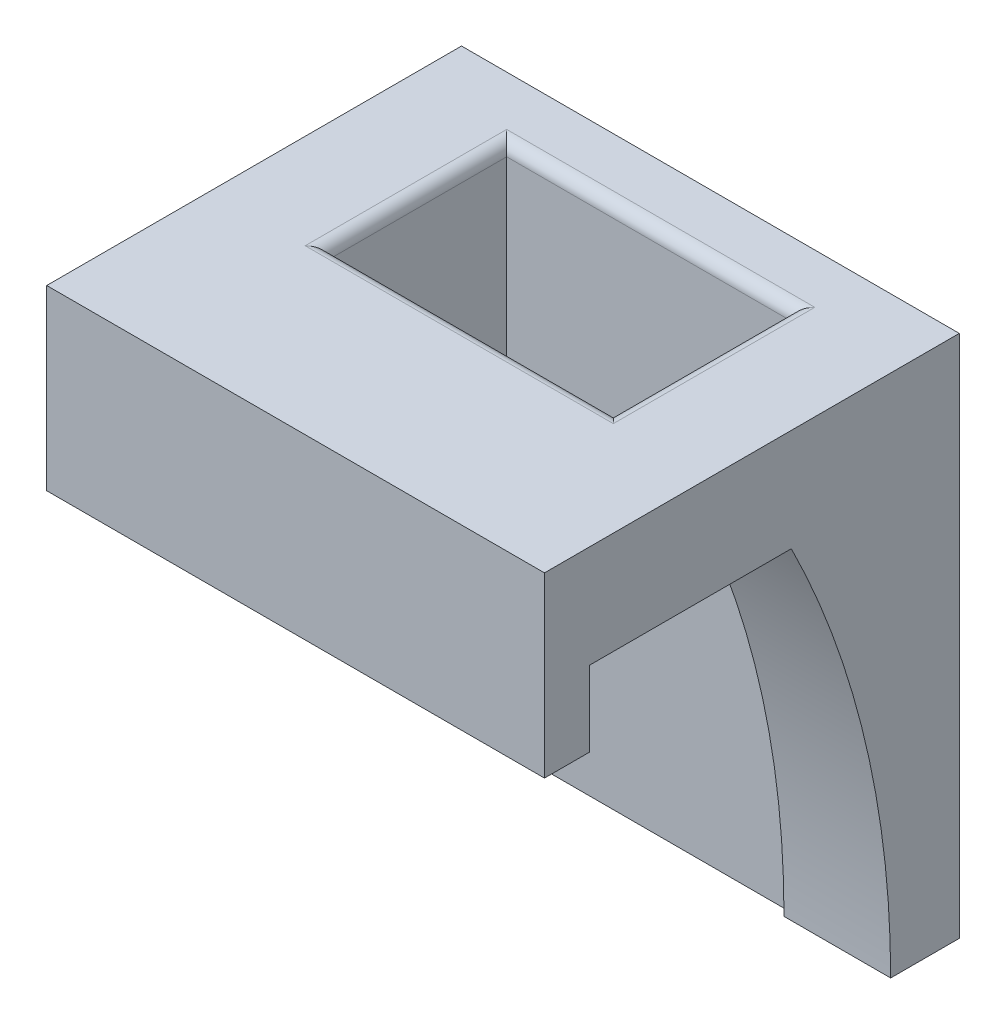
ISO-10303-21;
HEADER;
FILE_DESCRIPTION(('STEP AP214'),'2;1');
FILE_NAME('part.step','',(''),(''),'','','');
FILE_SCHEMA(('AUTOMOTIVE_DESIGN { 1 0 10303 214 1 1 1 1 }'));
ENDSEC;
DATA;
#1=APPLICATION_CONTEXT('core data for automotive mechanical design processes');
#2=APPLICATION_PROTOCOL_DEFINITION('international standard','automotive_design',2000,#1);
#3=PRODUCT_CONTEXT('',#1,'mechanical');
#4=PRODUCT('Part','Part','',(#3));
#5=PRODUCT_RELATED_PRODUCT_CATEGORY('part','',(#4));
#6=PRODUCT_DEFINITION_FORMATION('','',#4);
#7=PRODUCT_DEFINITION_CONTEXT('part definition',#1,'design');
#8=PRODUCT_DEFINITION('design','',#6,#7);
#9=PRODUCT_DEFINITION_SHAPE('','',#8);
#10=(LENGTH_UNIT() NAMED_UNIT(*) SI_UNIT(.MILLI.,.METRE.));
#11=(NAMED_UNIT(*) PLANE_ANGLE_UNIT() SI_UNIT($,.RADIAN.));
#12=(NAMED_UNIT(*) SI_UNIT($,.STERADIAN.) SOLID_ANGLE_UNIT());
#13=UNCERTAINTY_MEASURE_WITH_UNIT(LENGTH_MEASURE(1.E-05),#10,'distance_accuracy_value','');
#14=(GEOMETRIC_REPRESENTATION_CONTEXT(3) GLOBAL_UNCERTAINTY_ASSIGNED_CONTEXT((#13)) GLOBAL_UNIT_ASSIGNED_CONTEXT((#10,
#11,#12)) REPRESENTATION_CONTEXT('',''));
#15=CARTESIAN_POINT('',(0.,0.,0.));
#16=DIRECTION('',(0.,0.,1.));
#17=DIRECTION('',(1.,0.,0.));
#18=AXIS2_PLACEMENT_3D('',#15,#16,#17);
#19=CARTESIAN_POINT('',(21.,-35.56,54.2213030303032));
#20=DIRECTION('',(-1.,0.,0.));
#21=DIRECTION('',(0.,0.,1.));
#22=AXIS2_PLACEMENT_3D('',#19,#20,#21);
#23=CYLINDRICAL_SURFACE('',#22,79.6213030303032);
#24=DIRECTION('',(-1.,0.,0.));
#25=VECTOR('',#24,1.);
#26=CARTESIAN_POINT('',(21.,-35.56,-25.4));
#27=LINE('',#26,#25);
#28=CARTESIAN_POINT('',(-12.,-35.56,-25.4));
#29=VERTEX_POINT('',#28);
#30=CARTESIAN_POINT('',(-21.,-35.56,-25.4));
#31=VERTEX_POINT('',#30);
#32=EDGE_CURVE('E288',#29,#31,#27,.T.);
#33=ORIENTED_EDGE('',*,*,#32,.F.);
#34=CARTESIAN_POINT('',(-12.,-35.56,54.2213030303032));
#35=DIRECTION('',(-1.,0.,0.));
#36=DIRECTION('',(0.,0.,1.));
#37=AXIS2_PLACEMENT_3D('',#34,#35,#36);
#38=CIRCLE('',#37,79.6213030303032);
#39=CARTESIAN_POINT('',(-12.,0.,-17.018));
#40=VERTEX_POINT('',#39);
#41=EDGE_CURVE('E204',#29,#40,#38,.F.);
#42=ORIENTED_EDGE('',*,*,#41,.T.);
#43=DIRECTION('',(-1.,0.,0.));
#44=VECTOR('',#43,1.);
#45=CARTESIAN_POINT('',(21.,0.,-17.018));
#46=LINE('',#45,#44);
#47=CARTESIAN_POINT('',(-21.,0.,-17.018));
#48=VERTEX_POINT('',#47);
#49=EDGE_CURVE('E290',#40,#48,#46,.T.);
#50=ORIENTED_EDGE('',*,*,#49,.T.);
#51=CARTESIAN_POINT('',(-21.,-35.56,54.2213030303032));
#52=DIRECTION('',(-1.,0.,0.));
#53=DIRECTION('',(0.,0.,-1.));
#54=AXIS2_PLACEMENT_3D('',#51,#52,#53);
#55=CIRCLE('',#54,79.6213030303032);
#56=EDGE_CURVE('E241',#48,#31,#55,.T.);
#57=ORIENTED_EDGE('',*,*,#56,.T.);
#58=EDGE_LOOP('',(#33,#42,#50,#57));
#59=FACE_BOUND('',#58,.T.);
#60=ADVANCED_FACE('F43',(#59),#23,.F.);
#61=CARTESIAN_POINT('',(21.,0.,0.));
#62=DIRECTION('',(0.,1.,0.));
#63=DIRECTION('',(0.,0.,1.));
#64=AXIS2_PLACEMENT_3D('',#61,#62,#63);
#65=PLANE('',#64);
#66=ORIENTED_EDGE('',*,*,#49,.F.);
#67=DIRECTION('',(0.,0.,1.));
#68=VECTOR('',#67,1.);
#69=CARTESIAN_POINT('',(-12.,0.,0.));
#70=LINE('',#69,#68);
#71=CARTESIAN_POINT('',(-12.,0.,-11.));
#72=VERTEX_POINT('',#71);
#73=EDGE_CURVE('E208',#40,#72,#70,.T.);
#74=ORIENTED_EDGE('',*,*,#73,.T.);
#75=DIRECTION('',(1.,0.,0.));
#76=VECTOR('',#75,1.);
#77=CARTESIAN_POINT('',(21.,0.,-11.));
#78=LINE('',#77,#76);
#79=CARTESIAN_POINT('',(12.,0.,-11.));
#80=VERTEX_POINT('',#79);
#81=EDGE_CURVE('E186',#72,#80,#78,.T.);
#82=ORIENTED_EDGE('',*,*,#81,.T.);
#83=DIRECTION('',(0.,0.,-1.));
#84=VECTOR('',#83,1.);
#85=CARTESIAN_POINT('',(12.,0.,0.));
#86=LINE('',#85,#84);
#87=CARTESIAN_POINT('',(12.,0.,-17.018));
#88=VERTEX_POINT('',#87);
#89=EDGE_CURVE('E199',#80,#88,#86,.T.);
#90=ORIENTED_EDGE('',*,*,#89,.T.);
#91=CARTESIAN_POINT('',(21.,0.,-17.018));
#92=VERTEX_POINT('',#91);
#93=EDGE_CURVE('E286',#92,#88,#46,.T.);
#94=ORIENTED_EDGE('',*,*,#93,.F.);
#95=DIRECTION('',(0.,0.,-1.));
#96=VECTOR('',#95,1.);
#97=CARTESIAN_POINT('',(21.,0.,0.));
#98=LINE('',#97,#96);
#99=CARTESIAN_POINT('',(21.,0.,0.));
#100=VERTEX_POINT('',#99);
#101=EDGE_CURVE('E213',#100,#92,#98,.T.);
#102=ORIENTED_EDGE('',*,*,#101,.F.);
#103=DIRECTION('',(-1.,0.,0.));
#104=VECTOR('',#103,1.);
#105=CARTESIAN_POINT('',(21.,0.,0.));
#106=LINE('',#105,#104);
#107=CARTESIAN_POINT('',(-21.,0.,0.));
#108=VERTEX_POINT('',#107);
#109=EDGE_CURVE('E239',#100,#108,#106,.T.);
#110=ORIENTED_EDGE('',*,*,#109,.T.);
#111=DIRECTION('',(0.,0.,-1.));
#112=VECTOR('',#111,1.);
#113=CARTESIAN_POINT('',(-21.,0.,0.));
#114=LINE('',#113,#112);
#115=EDGE_CURVE('E215',#108,#48,#114,.T.);
#116=ORIENTED_EDGE('',*,*,#115,.T.);
#117=EDGE_LOOP('',(#66,#74,#82,#90,#94,#102,#110,#116));
#118=FACE_BOUND('',#117,.T.);
#119=ADVANCED_FACE('F351',(#118),#65,.F.);
#120=ORIENTED_EDGE('',*,*,#93,.T.);
#121=CARTESIAN_POINT('',(12.,-35.56,54.2213030303032));
#122=DIRECTION('',(1.,0.,0.));
#123=DIRECTION('',(0.,0.,-1.));
#124=AXIS2_PLACEMENT_3D('',#121,#122,#123);
#125=CIRCLE('',#124,79.6213030303032);
#126=CARTESIAN_POINT('',(12.,-35.56,-25.4));
#127=VERTEX_POINT('',#126);
#128=EDGE_CURVE('E197',#88,#127,#125,.F.);
#129=ORIENTED_EDGE('',*,*,#128,.T.);
#130=CARTESIAN_POINT('',(21.,-35.56,-25.4));
#131=VERTEX_POINT('',#130);
#132=EDGE_CURVE('E177',#131,#127,#27,.T.);
#133=ORIENTED_EDGE('',*,*,#132,.F.);
#134=CARTESIAN_POINT('',(21.,-35.56,54.2213030303032));
#135=DIRECTION('',(-1.,0.,0.));
#136=DIRECTION('',(0.,0.,-1.));
#137=AXIS2_PLACEMENT_3D('',#134,#135,#136);
#138=CIRCLE('',#137,79.6213030303032);
#139=EDGE_CURVE('E220',#92,#131,#138,.T.);
#140=ORIENTED_EDGE('',*,*,#139,.F.);
#141=EDGE_LOOP('',(#120,#129,#133,#140));
#142=FACE_BOUND('',#141,.T.);
#143=ADVANCED_FACE('F358',(#142),#23,.F.);
#144=CARTESIAN_POINT('',(21.,-35.56,-31.19));
#145=DIRECTION('',(0.,1.,0.));
#146=DIRECTION('',(0.,0.,1.));
#147=AXIS2_PLACEMENT_3D('',#144,#145,#146);
#148=PLANE('',#147);
#149=DIRECTION('',(-1.,0.,0.));
#150=VECTOR('',#149,1.);
#151=CARTESIAN_POINT('',(-12.,-35.56,-26.));
#152=LINE('',#151,#150);
#153=CARTESIAN_POINT('',(12.,-35.56,-26.));
#154=VERTEX_POINT('',#153);
#155=CARTESIAN_POINT('',(-12.,-35.56,-26.));
#156=VERTEX_POINT('',#155);
#157=EDGE_CURVE('E170',#154,#156,#152,.T.);
#158=ORIENTED_EDGE('',*,*,#157,.T.);
#159=DIRECTION('',(0.,0.,1.));
#160=VECTOR('',#159,1.);
#161=CARTESIAN_POINT('',(-12.,-35.56,-26.));
#162=LINE('',#161,#160);
#163=EDGE_CURVE('E176',#156,#29,#162,.T.);
#164=ORIENTED_EDGE('',*,*,#163,.T.);
#165=ORIENTED_EDGE('',*,*,#32,.T.);
#166=DIRECTION('',(0.,0.,-1.));
#167=VECTOR('',#166,1.);
#168=CARTESIAN_POINT('',(-21.,-35.56,-31.19));
#169=LINE('',#168,#167);
#170=CARTESIAN_POINT('',(-21.,-35.56,-31.19));
#171=VERTEX_POINT('',#170);
#172=EDGE_CURVE('E249',#31,#171,#169,.T.);
#173=ORIENTED_EDGE('',*,*,#172,.T.);
#174=DIRECTION('',(-1.,0.,0.));
#175=VECTOR('',#174,1.);
#176=CARTESIAN_POINT('',(21.,-35.56,-31.19));
#177=LINE('',#176,#175);
#178=CARTESIAN_POINT('',(21.,-35.56,-31.19));
#179=VERTEX_POINT('',#178);
#180=EDGE_CURVE('E285',#179,#171,#177,.T.);
#181=ORIENTED_EDGE('',*,*,#180,.F.);
#182=DIRECTION('',(0.,0.,-1.));
#183=VECTOR('',#182,1.);
#184=CARTESIAN_POINT('',(21.,-35.56,-31.19));
#185=LINE('',#184,#183);
#186=EDGE_CURVE('E222',#131,#179,#185,.T.);
#187=ORIENTED_EDGE('',*,*,#186,.F.);
#188=ORIENTED_EDGE('',*,*,#132,.T.);
#189=DIRECTION('',(0.,0.,-1.));
#190=VECTOR('',#189,1.);
#191=CARTESIAN_POINT('',(12.,-35.56,-26.));
#192=LINE('',#191,#190);
#193=EDGE_CURVE('E159',#127,#154,#192,.T.);
#194=ORIENTED_EDGE('',*,*,#193,.T.);
#195=EDGE_LOOP('',(#158,#164,#165,#173,#181,#187,#188,#194));
#196=FACE_BOUND('',#195,.T.);
#197=ADVANCED_FACE('F172',(#196),#148,.F.);
#198=CARTESIAN_POINT('',(21.,8.65,-31.19));
#199=DIRECTION('',(0.,0.,1.));
#200=DIRECTION('',(1.,0.,0.));
#201=AXIS2_PLACEMENT_3D('',#198,#199,#200);
#202=PLANE('',#201);
#203=DIRECTION('',(0.,1.,0.));
#204=VECTOR('',#203,1.);
#205=CARTESIAN_POINT('',(-21.,8.65,-31.19));
#206=LINE('',#205,#204);
#207=CARTESIAN_POINT('',(-21.,8.65,-31.19));
#208=VERTEX_POINT('',#207);
#209=EDGE_CURVE('E246',#171,#208,#206,.T.);
#210=ORIENTED_EDGE('',*,*,#209,.T.);
#211=DIRECTION('',(-1.,0.,0.));
#212=VECTOR('',#211,1.);
#213=CARTESIAN_POINT('',(21.,8.65,-31.19));
#214=LINE('',#213,#212);
#215=CARTESIAN_POINT('',(21.,8.65,-31.19));
#216=VERTEX_POINT('',#215);
#217=EDGE_CURVE('E279',#216,#208,#214,.T.);
#218=ORIENTED_EDGE('',*,*,#217,.F.);
#219=DIRECTION('',(0.,1.,0.));
#220=VECTOR('',#219,1.);
#221=CARTESIAN_POINT('',(21.,8.65,-31.19));
#222=LINE('',#221,#220);
#223=EDGE_CURVE('E221',#179,#216,#222,.T.);
#224=ORIENTED_EDGE('',*,*,#223,.F.);
#225=ORIENTED_EDGE('',*,*,#180,.T.);
#226=EDGE_LOOP('',(#210,#218,#224,#225));
#227=FACE_BOUND('',#226,.T.);
#228=ADVANCED_FACE('F378',(#227),#202,.F.);
#229=CARTESIAN_POINT('',(21.,8.65,3.81));
#230=DIRECTION('',(0.,-1.,0.));
#231=DIRECTION('',(0.,0.,-1.));
#232=AXIS2_PLACEMENT_3D('',#229,#230,#231);
#233=PLANE('',#232);
#234=DIRECTION('',(0.,0.,-1.));
#235=VECTOR('',#234,1.);
#236=CARTESIAN_POINT('',(13.,8.65,3.81));
#237=LINE('',#236,#235);
#238=CARTESIAN_POINT('',(13.,8.65,-27.));
#239=VERTEX_POINT('',#238);
#240=CARTESIAN_POINT('',(13.,8.65,-10.));
#241=VERTEX_POINT('',#240);
#242=EDGE_CURVE('E305',#239,#241,#237,.F.);
#243=ORIENTED_EDGE('',*,*,#242,.T.);
#244=DIRECTION('',(1.,0.,0.));
#245=VECTOR('',#244,1.);
#246=CARTESIAN_POINT('',(21.,8.65,-10.));
#247=LINE('',#246,#245);
#248=CARTESIAN_POINT('',(-13.,8.65,-10.));
#249=VERTEX_POINT('',#248);
#250=EDGE_CURVE('E307',#241,#249,#247,.F.);
#251=ORIENTED_EDGE('',*,*,#250,.T.);
#252=DIRECTION('',(0.,0.,1.));
#253=VECTOR('',#252,1.);
#254=CARTESIAN_POINT('',(-13.,8.65,3.81));
#255=LINE('',#254,#253);
#256=CARTESIAN_POINT('',(-13.,8.65,-27.));
#257=VERTEX_POINT('',#256);
#258=EDGE_CURVE('E296',#249,#257,#255,.F.);
#259=ORIENTED_EDGE('',*,*,#258,.T.);
#260=DIRECTION('',(-1.,0.,0.));
#261=VECTOR('',#260,1.);
#262=CARTESIAN_POINT('',(21.,8.65,-27.));
#263=LINE('',#262,#261);
#264=EDGE_CURVE('E303',#257,#239,#263,.F.);
#265=ORIENTED_EDGE('',*,*,#264,.T.);
#266=EDGE_LOOP('',(#243,#251,#259,#265));
#267=FACE_BOUND('',#266,.T.);
#268=DIRECTION('',(0.,0.,1.));
#269=VECTOR('',#268,1.);
#270=CARTESIAN_POINT('',(-21.,8.65,3.81));
#271=LINE('',#270,#269);
#272=CARTESIAN_POINT('',(-21.,8.65,3.81));
#273=VERTEX_POINT('',#272);
#274=EDGE_CURVE('E251',#208,#273,#271,.T.);
#275=ORIENTED_EDGE('',*,*,#274,.T.);
#276=DIRECTION('',(-1.,0.,0.));
#277=VECTOR('',#276,1.);
#278=CARTESIAN_POINT('',(21.,8.65,3.81));
#279=LINE('',#278,#277);
#280=CARTESIAN_POINT('',(21.,8.65,3.81));
#281=VERTEX_POINT('',#280);
#282=EDGE_CURVE('E273',#281,#273,#279,.T.);
#283=ORIENTED_EDGE('',*,*,#282,.F.);
#284=DIRECTION('',(0.,0.,1.));
#285=VECTOR('',#284,1.);
#286=CARTESIAN_POINT('',(21.,8.65,3.81));
#287=LINE('',#286,#285);
#288=EDGE_CURVE('E230',#216,#281,#287,.T.);
#289=ORIENTED_EDGE('',*,*,#288,.F.);
#290=ORIENTED_EDGE('',*,*,#217,.T.);
#291=EDGE_LOOP('',(#275,#283,#289,#290));
#292=FACE_BOUND('',#291,.T.);
#293=ADVANCED_FACE('F336',(#267,#292),#233,.F.);
#294=CARTESIAN_POINT('',(21.,-6.35,3.81));
#295=DIRECTION('',(0.,0.,-1.));
#296=DIRECTION('',(-1.,0.,0.));
#297=AXIS2_PLACEMENT_3D('',#294,#295,#296);
#298=PLANE('',#297);
#299=DIRECTION('',(0.,-1.,0.));
#300=VECTOR('',#299,1.);
#301=CARTESIAN_POINT('',(-21.,-6.35,3.81));
#302=LINE('',#301,#300);
#303=CARTESIAN_POINT('',(-21.,-6.35,3.81));
#304=VERTEX_POINT('',#303);
#305=EDGE_CURVE('E258',#273,#304,#302,.T.);
#306=ORIENTED_EDGE('',*,*,#305,.T.);
#307=DIRECTION('',(-1.,0.,0.));
#308=VECTOR('',#307,1.);
#309=CARTESIAN_POINT('',(21.,-6.35,3.81));
#310=LINE('',#309,#308);
#311=CARTESIAN_POINT('',(21.,-6.35,3.81));
#312=VERTEX_POINT('',#311);
#313=EDGE_CURVE('E269',#312,#304,#310,.T.);
#314=ORIENTED_EDGE('',*,*,#313,.F.);
#315=DIRECTION('',(0.,-1.,0.));
#316=VECTOR('',#315,1.);
#317=CARTESIAN_POINT('',(21.,-6.35,3.81));
#318=LINE('',#317,#316);
#319=EDGE_CURVE('E227',#281,#312,#318,.T.);
#320=ORIENTED_EDGE('',*,*,#319,.F.);
#321=ORIENTED_EDGE('',*,*,#282,.T.);
#322=EDGE_LOOP('',(#306,#314,#320,#321));
#323=FACE_BOUND('',#322,.T.);
#324=ADVANCED_FACE('F387',(#323),#298,.F.);
#325=CARTESIAN_POINT('',(21.,-6.35,0.));
#326=DIRECTION('',(0.,1.,0.));
#327=DIRECTION('',(0.,0.,1.));
#328=AXIS2_PLACEMENT_3D('',#325,#326,#327);
#329=PLANE('',#328);
#330=DIRECTION('',(0.,0.,-1.));
#331=VECTOR('',#330,1.);
#332=CARTESIAN_POINT('',(-21.,-6.35,0.));
#333=LINE('',#332,#331);
#334=CARTESIAN_POINT('',(-21.,-6.35,0.));
#335=VERTEX_POINT('',#334);
#336=EDGE_CURVE('E259',#304,#335,#333,.T.);
#337=ORIENTED_EDGE('',*,*,#336,.T.);
#338=DIRECTION('',(-1.,0.,0.));
#339=VECTOR('',#338,1.);
#340=CARTESIAN_POINT('',(21.,-6.35,0.));
#341=LINE('',#340,#339);
#342=CARTESIAN_POINT('',(21.,-6.35,0.));
#343=VERTEX_POINT('',#342);
#344=EDGE_CURVE('E266',#343,#335,#341,.T.);
#345=ORIENTED_EDGE('',*,*,#344,.F.);
#346=DIRECTION('',(0.,0.,-1.));
#347=VECTOR('',#346,1.);
#348=CARTESIAN_POINT('',(21.,-6.35,0.));
#349=LINE('',#348,#347);
#350=EDGE_CURVE('E232',#312,#343,#349,.T.);
#351=ORIENTED_EDGE('',*,*,#350,.F.);
#352=ORIENTED_EDGE('',*,*,#313,.T.);
#353=EDGE_LOOP('',(#337,#345,#351,#352));
#354=FACE_BOUND('',#353,.T.);
#355=ADVANCED_FACE('F393',(#354),#329,.F.);
#356=CARTESIAN_POINT('',(21.,0.,0.));
#357=DIRECTION('',(0.,0.,1.));
#358=DIRECTION('',(0.,-1.,0.));
#359=AXIS2_PLACEMENT_3D('',#356,#357,#358);
#360=PLANE('',#359);
#361=DIRECTION('',(0.,1.,0.));
#362=VECTOR('',#361,1.);
#363=CARTESIAN_POINT('',(-21.,0.,0.));
#364=LINE('',#363,#362);
#365=EDGE_CURVE('E217',#335,#108,#364,.T.);
#366=ORIENTED_EDGE('',*,*,#365,.T.);
#367=ORIENTED_EDGE('',*,*,#109,.F.);
#368=DIRECTION('',(0.,1.,0.));
#369=VECTOR('',#368,1.);
#370=CARTESIAN_POINT('',(21.,0.,0.));
#371=LINE('',#370,#369);
#372=EDGE_CURVE('E237',#343,#100,#371,.T.);
#373=ORIENTED_EDGE('',*,*,#372,.F.);
#374=ORIENTED_EDGE('',*,*,#344,.T.);
#375=EDGE_LOOP('',(#366,#367,#373,#374));
#376=FACE_BOUND('',#375,.T.);
#377=ADVANCED_FACE('F395',(#376),#360,.F.);
#378=CARTESIAN_POINT('',(21.,-35.56,54.2213030303032));
#379=DIRECTION('',(1.,0.,0.));
#380=DIRECTION('',(0.,0.,-1.));
#381=AXIS2_PLACEMENT_3D('',#378,#379,#380);
#382=PLANE('',#381);
#383=ORIENTED_EDGE('',*,*,#101,.T.);
#384=ORIENTED_EDGE('',*,*,#139,.T.);
#385=ORIENTED_EDGE('',*,*,#186,.T.);
#386=ORIENTED_EDGE('',*,*,#223,.T.);
#387=ORIENTED_EDGE('',*,*,#288,.T.);
#388=ORIENTED_EDGE('',*,*,#319,.T.);
#389=ORIENTED_EDGE('',*,*,#350,.T.);
#390=ORIENTED_EDGE('',*,*,#372,.T.);
#391=EDGE_LOOP('',(#383,#384,#385,#386,#387,#388,#389,#390));
#392=FACE_BOUND('',#391,.T.);
#393=ADVANCED_FACE('F357',(#392),#382,.T.);
#394=CARTESIAN_POINT('',(-21.,-35.56,54.2213030303032));
#395=DIRECTION('',(1.,0.,0.));
#396=DIRECTION('',(0.,0.,-1.));
#397=AXIS2_PLACEMENT_3D('',#394,#395,#396);
#398=PLANE('',#397);
#399=ORIENTED_EDGE('',*,*,#115,.F.);
#400=ORIENTED_EDGE('',*,*,#365,.F.);
#401=ORIENTED_EDGE('',*,*,#336,.F.);
#402=ORIENTED_EDGE('',*,*,#305,.F.);
#403=ORIENTED_EDGE('',*,*,#274,.F.);
#404=ORIENTED_EDGE('',*,*,#209,.F.);
#405=ORIENTED_EDGE('',*,*,#172,.F.);
#406=ORIENTED_EDGE('',*,*,#56,.F.);
#407=EDGE_LOOP('',(#399,#400,#401,#402,#403,#404,#405,#406));
#408=FACE_BOUND('',#407,.T.);
#409=ADVANCED_FACE('F368',(#408),#398,.F.);
#410=CARTESIAN_POINT('',(-12.,-35.56,-26.));
#411=DIRECTION('',(-1.,0.,0.));
#412=DIRECTION('',(0.,0.,1.));
#413=AXIS2_PLACEMENT_3D('',#410,#411,#412);
#414=PLANE('',#413);
#415=DIRECTION('',(0.,1.,0.));
#416=VECTOR('',#415,1.);
#417=CARTESIAN_POINT('',(-12.,-35.56,-26.));
#418=LINE('',#417,#416);
#419=CARTESIAN_POINT('',(-12.,7.65,-26.));
#420=VERTEX_POINT('',#419);
#421=EDGE_CURVE('E162',#156,#420,#418,.T.);
#422=ORIENTED_EDGE('',*,*,#421,.T.);
#423=DIRECTION('',(0.,0.,1.));
#424=VECTOR('',#423,1.);
#425=CARTESIAN_POINT('',(-12.,7.65,-26.));
#426=LINE('',#425,#424);
#427=CARTESIAN_POINT('',(-12.,7.65,-11.));
#428=VERTEX_POINT('',#427);
#429=EDGE_CURVE('E11',#420,#428,#426,.T.);
#430=ORIENTED_EDGE('',*,*,#429,.T.);
#431=DIRECTION('',(0.,1.,0.));
#432=VECTOR('',#431,1.);
#433=CARTESIAN_POINT('',(-12.,-35.56,-11.));
#434=LINE('',#433,#432);
#435=EDGE_CURVE('E175',#72,#428,#434,.T.);
#436=ORIENTED_EDGE('',*,*,#435,.F.);
#437=ORIENTED_EDGE('',*,*,#73,.F.);
#438=ORIENTED_EDGE('',*,*,#41,.F.);
#439=ORIENTED_EDGE('',*,*,#163,.F.);
#440=EDGE_LOOP('',(#422,#430,#436,#437,#438,#439));
#441=FACE_BOUND('',#440,.T.);
#442=ADVANCED_FACE('F372',(#441),#414,.F.);
#443=CARTESIAN_POINT('',(12.,-35.56,-26.));
#444=DIRECTION('',(1.,0.,0.));
#445=DIRECTION('',(0.,0.,-1.));
#446=AXIS2_PLACEMENT_3D('',#443,#444,#445);
#447=PLANE('',#446);
#448=DIRECTION('',(0.,1.,0.));
#449=VECTOR('',#448,1.);
#450=CARTESIAN_POINT('',(12.,-35.56,-11.));
#451=LINE('',#450,#449);
#452=CARTESIAN_POINT('',(12.,7.65,-11.));
#453=VERTEX_POINT('',#452);
#454=EDGE_CURVE('E163',#80,#453,#451,.T.);
#455=ORIENTED_EDGE('',*,*,#454,.T.);
#456=DIRECTION('',(0.,0.,-1.));
#457=VECTOR('',#456,1.);
#458=CARTESIAN_POINT('',(12.,7.65,-26.));
#459=LINE('',#458,#457);
#460=CARTESIAN_POINT('',(12.,7.65,-26.));
#461=VERTEX_POINT('',#460);
#462=EDGE_CURVE('E67',#453,#461,#459,.T.);
#463=ORIENTED_EDGE('',*,*,#462,.T.);
#464=DIRECTION('',(0.,1.,0.));
#465=VECTOR('',#464,1.);
#466=CARTESIAN_POINT('',(12.,-35.56,-26.));
#467=LINE('',#466,#465);
#468=EDGE_CURVE('E156',#154,#461,#467,.T.);
#469=ORIENTED_EDGE('',*,*,#468,.F.);
#470=ORIENTED_EDGE('',*,*,#193,.F.);
#471=ORIENTED_EDGE('',*,*,#128,.F.);
#472=ORIENTED_EDGE('',*,*,#89,.F.);
#473=EDGE_LOOP('',(#455,#463,#469,#470,#471,#472));
#474=FACE_BOUND('',#473,.T.);
#475=ADVANCED_FACE('F158',(#474),#447,.F.);
#476=CARTESIAN_POINT('',(-12.,-35.56,-11.));
#477=DIRECTION('',(0.,0.,1.));
#478=DIRECTION('',(1.,0.,0.));
#479=AXIS2_PLACEMENT_3D('',#476,#477,#478);
#480=PLANE('',#479);
#481=ORIENTED_EDGE('',*,*,#435,.T.);
#482=DIRECTION('',(1.,0.,0.));
#483=VECTOR('',#482,1.);
#484=CARTESIAN_POINT('',(-12.,7.65,-11.));
#485=LINE('',#484,#483);
#486=EDGE_CURVE('E294',#428,#453,#485,.T.);
#487=ORIENTED_EDGE('',*,*,#486,.T.);
#488=ORIENTED_EDGE('',*,*,#454,.F.);
#489=ORIENTED_EDGE('',*,*,#81,.F.);
#490=EDGE_LOOP('',(#481,#487,#488,#489));
#491=FACE_BOUND('',#490,.T.);
#492=ADVANCED_FACE('F346',(#491),#480,.F.);
#493=CARTESIAN_POINT('',(-12.,-35.56,-26.));
#494=DIRECTION('',(0.,0.,-1.));
#495=DIRECTION('',(-1.,0.,0.));
#496=AXIS2_PLACEMENT_3D('',#493,#494,#495);
#497=PLANE('',#496);
#498=ORIENTED_EDGE('',*,*,#468,.T.);
#499=DIRECTION('',(-1.,0.,0.));
#500=VECTOR('',#499,1.);
#501=CARTESIAN_POINT('',(-12.,7.65,-26.));
#502=LINE('',#501,#500);
#503=EDGE_CURVE('E52',#461,#420,#502,.T.);
#504=ORIENTED_EDGE('',*,*,#503,.T.);
#505=ORIENTED_EDGE('',*,*,#421,.F.);
#506=ORIENTED_EDGE('',*,*,#157,.F.);
#507=EDGE_LOOP('',(#498,#504,#505,#506));
#508=FACE_BOUND('',#507,.T.);
#509=ADVANCED_FACE('F169',(#508),#497,.F.);
#510=CARTESIAN_POINT('',(-12.,7.65,-27.));
#511=DIRECTION('',(-1.,0.,0.));
#512=DIRECTION('',(0.,0.,1.));
#513=AXIS2_PLACEMENT_3D('',#510,#511,#512);
#514=CYLINDRICAL_SURFACE('',#513,1.);
#515=CARTESIAN_POINT('',(13.,7.65,-27.));
#516=DIRECTION('',(-0.707106781186548,0.,-0.707106781186547));
#517=DIRECTION('',(0.707106781186547,0.,-0.707106781186548));
#518=AXIS2_PLACEMENT_3D('',#515,#516,#517);
#519=ELLIPSE('',#518,1.41421356237309,1.);
#520=EDGE_CURVE('E319',#239,#461,#519,.F.);
#521=ORIENTED_EDGE('',*,*,#520,.F.);
#522=ORIENTED_EDGE('',*,*,#264,.F.);
#523=CARTESIAN_POINT('',(-13.,7.65,-27.));
#524=DIRECTION('',(-0.707106781186547,0.,0.707106781186548));
#525=DIRECTION('',(-0.707106781186548,0.,-0.707106781186547));
#526=AXIS2_PLACEMENT_3D('',#523,#524,#525);
#527=ELLIPSE('',#526,1.4142135623731,1.);
#528=EDGE_CURVE('E50',#420,#257,#527,.T.);
#529=ORIENTED_EDGE('',*,*,#528,.F.);
#530=ORIENTED_EDGE('',*,*,#503,.F.);
#531=EDGE_LOOP('',(#521,#522,#529,#530));
#532=FACE_BOUND('',#531,.T.);
#533=ADVANCED_FACE('F44',(#532),#514,.T.);
#534=CARTESIAN_POINT('',(-13.,7.65,-26.));
#535=DIRECTION('',(0.,0.,1.));
#536=DIRECTION('',(1.,0.,0.));
#537=AXIS2_PLACEMENT_3D('',#534,#535,#536);
#538=CYLINDRICAL_SURFACE('',#537,1.);
#539=ORIENTED_EDGE('',*,*,#528,.T.);
#540=ORIENTED_EDGE('',*,*,#258,.F.);
#541=CARTESIAN_POINT('',(-13.,7.65,-10.));
#542=DIRECTION('',(0.707106781186548,0.,0.707106781186547));
#543=DIRECTION('',(0.707106781186547,0.,-0.707106781186548));
#544=AXIS2_PLACEMENT_3D('',#541,#542,#543);
#545=ELLIPSE('',#544,1.41421356237309,1.);
#546=EDGE_CURVE('E318',#428,#249,#545,.T.);
#547=ORIENTED_EDGE('',*,*,#546,.F.);
#548=ORIENTED_EDGE('',*,*,#429,.F.);
#549=EDGE_LOOP('',(#539,#540,#547,#548));
#550=FACE_BOUND('',#549,.T.);
#551=ADVANCED_FACE('F334',(#550),#538,.T.);
#552=CARTESIAN_POINT('',(13.,7.65,-26.));
#553=DIRECTION('',(0.,0.,-1.));
#554=DIRECTION('',(-1.,0.,0.));
#555=AXIS2_PLACEMENT_3D('',#552,#553,#554);
#556=CYLINDRICAL_SURFACE('',#555,1.);
#557=ORIENTED_EDGE('',*,*,#520,.T.);
#558=ORIENTED_EDGE('',*,*,#462,.F.);
#559=CARTESIAN_POINT('',(13.,7.65,-10.));
#560=DIRECTION('',(0.707106781186547,0.,-0.707106781186548));
#561=DIRECTION('',(0.707106781186548,0.,0.707106781186547));
#562=AXIS2_PLACEMENT_3D('',#559,#560,#561);
#563=ELLIPSE('',#562,1.4142135623731,1.);
#564=EDGE_CURVE('E312',#241,#453,#563,.F.);
#565=ORIENTED_EDGE('',*,*,#564,.F.);
#566=ORIENTED_EDGE('',*,*,#242,.F.);
#567=EDGE_LOOP('',(#557,#558,#565,#566));
#568=FACE_BOUND('',#567,.T.);
#569=ADVANCED_FACE('F341',(#568),#556,.T.);
#570=CARTESIAN_POINT('',(-12.,7.65,-10.));
#571=DIRECTION('',(1.,0.,0.));
#572=DIRECTION('',(0.,0.,-1.));
#573=AXIS2_PLACEMENT_3D('',#570,#571,#572);
#574=CYLINDRICAL_SURFACE('',#573,1.);
#575=ORIENTED_EDGE('',*,*,#546,.T.);
#576=ORIENTED_EDGE('',*,*,#250,.F.);
#577=ORIENTED_EDGE('',*,*,#564,.T.);
#578=ORIENTED_EDGE('',*,*,#486,.F.);
#579=EDGE_LOOP('',(#575,#576,#577,#578));
#580=FACE_BOUND('',#579,.T.);
#581=ADVANCED_FACE('F342',(#580),#574,.T.);
#582=CLOSED_SHELL('',(#60,#119,#143,#197,#228,#293,#324,#355,#377,#393,#409,#442,#475,#492,#509,
#533,#551,#569,#581));
#583=MANIFOLD_SOLID_BREP('B2',#582);
#584=ADVANCED_BREP_SHAPE_REPRESENTATION('',(#18,#583),#14);
#585=SHAPE_DEFINITION_REPRESENTATION(#9,#584);
ENDSEC;
END-ISO-10303-21;
